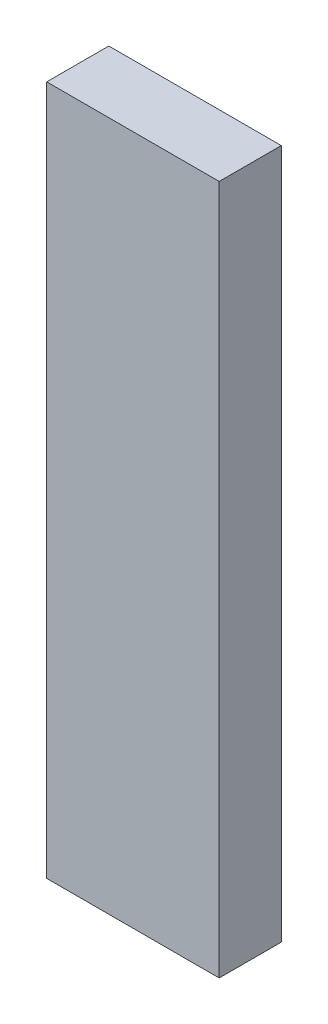
ISO-10303-21;
HEADER;
FILE_DESCRIPTION(('STEP AP214'),'2;1');
FILE_NAME('part.step','',(''),(''),'','','');
FILE_SCHEMA(('AUTOMOTIVE_DESIGN { 1 0 10303 214 1 1 1 1 }'));
ENDSEC;
DATA;
#1=APPLICATION_CONTEXT('core data for automotive mechanical design processes');
#2=APPLICATION_PROTOCOL_DEFINITION('international standard','automotive_design',2000,#1);
#3=PRODUCT_CONTEXT('',#1,'mechanical');
#4=PRODUCT('Part','Part','',(#3));
#5=PRODUCT_RELATED_PRODUCT_CATEGORY('part','',(#4));
#6=PRODUCT_DEFINITION_FORMATION('','',#4);
#7=PRODUCT_DEFINITION_CONTEXT('part definition',#1,'design');
#8=PRODUCT_DEFINITION('design','',#6,#7);
#9=PRODUCT_DEFINITION_SHAPE('','',#8);
#10=(LENGTH_UNIT() NAMED_UNIT(*) SI_UNIT(.MILLI.,.METRE.));
#11=(NAMED_UNIT(*) PLANE_ANGLE_UNIT() SI_UNIT($,.RADIAN.));
#12=(NAMED_UNIT(*) SI_UNIT($,.STERADIAN.) SOLID_ANGLE_UNIT());
#13=UNCERTAINTY_MEASURE_WITH_UNIT(LENGTH_MEASURE(1.E-05),#10,'distance_accuracy_value','');
#14=(GEOMETRIC_REPRESENTATION_CONTEXT(3) GLOBAL_UNCERTAINTY_ASSIGNED_CONTEXT((#13)) GLOBAL_UNIT_ASSIGNED_CONTEXT((#10,
#11,#12)) REPRESENTATION_CONTEXT('',''));
#15=CARTESIAN_POINT('',(0.,0.,0.));
#16=DIRECTION('',(0.,0.,1.));
#17=DIRECTION('',(1.,0.,0.));
#18=AXIS2_PLACEMENT_3D('',#15,#16,#17);
#19=CARTESIAN_POINT('',(0.,0.,18.));
#20=DIRECTION('',(1.,0.,0.));
#21=DIRECTION('',(0.,0.,-1.));
#22=AXIS2_PLACEMENT_3D('',#19,#20,#21);
#23=PLANE('',#22);
#24=DIRECTION('',(0.,-1.,0.));
#25=VECTOR('',#24,1.);
#26=CARTESIAN_POINT('',(0.,0.,0.));
#27=LINE('',#26,#25);
#28=CARTESIAN_POINT('',(0.,200.,0.));
#29=VERTEX_POINT('',#28);
#30=CARTESIAN_POINT('',(0.,0.,0.));
#31=VERTEX_POINT('',#30);
#32=EDGE_CURVE('E96',#29,#31,#27,.T.);
#33=ORIENTED_EDGE('',*,*,#32,.T.);
#34=DIRECTION('',(0.,0.,-1.));
#35=VECTOR('',#34,1.);
#36=CARTESIAN_POINT('',(0.,0.,18.));
#37=LINE('',#36,#35);
#38=CARTESIAN_POINT('',(0.,0.,18.));
#39=VERTEX_POINT('',#38);
#40=EDGE_CURVE('E11',#39,#31,#37,.T.);
#41=ORIENTED_EDGE('',*,*,#40,.F.);
#42=DIRECTION('',(0.,-1.,0.));
#43=VECTOR('',#42,1.);
#44=CARTESIAN_POINT('',(0.,0.,18.));
#45=LINE('',#44,#43);
#46=CARTESIAN_POINT('',(0.,200.,18.));
#47=VERTEX_POINT('',#46);
#48=EDGE_CURVE('E84',#47,#39,#45,.T.);
#49=ORIENTED_EDGE('',*,*,#48,.F.);
#50=DIRECTION('',(0.,0.,-1.));
#51=VECTOR('',#50,1.);
#52=CARTESIAN_POINT('',(0.,200.,18.));
#53=LINE('',#52,#51);
#54=EDGE_CURVE('E92',#47,#29,#53,.T.);
#55=ORIENTED_EDGE('',*,*,#54,.T.);
#56=EDGE_LOOP('',(#33,#41,#49,#55));
#57=FACE_BOUND('',#56,.T.);
#58=ADVANCED_FACE('F33',(#57),#23,.F.);
#59=CARTESIAN_POINT('',(0.,0.,18.));
#60=DIRECTION('',(0.,1.,0.));
#61=DIRECTION('',(0.,0.,1.));
#62=AXIS2_PLACEMENT_3D('',#59,#60,#61);
#63=PLANE('',#62);
#64=DIRECTION('',(1.,0.,0.));
#65=VECTOR('',#64,1.);
#66=CARTESIAN_POINT('',(0.,0.,0.));
#67=LINE('',#66,#65);
#68=CARTESIAN_POINT('',(50.,0.,0.));
#69=VERTEX_POINT('',#68);
#70=EDGE_CURVE('E88',#31,#69,#67,.T.);
#71=ORIENTED_EDGE('',*,*,#70,.T.);
#72=DIRECTION('',(0.,0.,-1.));
#73=VECTOR('',#72,1.);
#74=CARTESIAN_POINT('',(50.,0.,18.));
#75=LINE('',#74,#73);
#76=CARTESIAN_POINT('',(50.,0.,18.));
#77=VERTEX_POINT('',#76);
#78=EDGE_CURVE('E41',#77,#69,#75,.T.);
#79=ORIENTED_EDGE('',*,*,#78,.F.);
#80=DIRECTION('',(1.,0.,0.));
#81=VECTOR('',#80,1.);
#82=CARTESIAN_POINT('',(0.,0.,18.));
#83=LINE('',#82,#81);
#84=EDGE_CURVE('E79',#39,#77,#83,.T.);
#85=ORIENTED_EDGE('',*,*,#84,.F.);
#86=ORIENTED_EDGE('',*,*,#40,.T.);
#87=EDGE_LOOP('',(#71,#79,#85,#86));
#88=FACE_BOUND('',#87,.T.);
#89=ADVANCED_FACE('F87',(#88),#63,.F.);
#90=CARTESIAN_POINT('',(50.,0.,18.));
#91=DIRECTION('',(-1.,0.,0.));
#92=DIRECTION('',(0.,0.,1.));
#93=AXIS2_PLACEMENT_3D('',#90,#91,#92);
#94=PLANE('',#93);
#95=DIRECTION('',(0.,1.,0.));
#96=VECTOR('',#95,1.);
#97=CARTESIAN_POINT('',(50.,0.,0.));
#98=LINE('',#97,#96);
#99=CARTESIAN_POINT('',(50.,200.,0.));
#100=VERTEX_POINT('',#99);
#101=EDGE_CURVE('E66',#69,#100,#98,.T.);
#102=ORIENTED_EDGE('',*,*,#101,.T.);
#103=DIRECTION('',(0.,0.,-1.));
#104=VECTOR('',#103,1.);
#105=CARTESIAN_POINT('',(50.,200.,18.));
#106=LINE('',#105,#104);
#107=CARTESIAN_POINT('',(50.,200.,18.));
#108=VERTEX_POINT('',#107);
#109=EDGE_CURVE('E89',#108,#100,#106,.T.);
#110=ORIENTED_EDGE('',*,*,#109,.F.);
#111=DIRECTION('',(0.,1.,0.));
#112=VECTOR('',#111,1.);
#113=CARTESIAN_POINT('',(50.,0.,18.));
#114=LINE('',#113,#112);
#115=EDGE_CURVE('E82',#77,#108,#114,.T.);
#116=ORIENTED_EDGE('',*,*,#115,.F.);
#117=ORIENTED_EDGE('',*,*,#78,.T.);
#118=EDGE_LOOP('',(#102,#110,#116,#117));
#119=FACE_BOUND('',#118,.T.);
#120=ADVANCED_FACE('F90',(#119),#94,.F.);
#121=CARTESIAN_POINT('',(0.,200.,18.));
#122=DIRECTION('',(0.,-1.,0.));
#123=DIRECTION('',(0.,0.,-1.));
#124=AXIS2_PLACEMENT_3D('',#121,#122,#123);
#125=PLANE('',#124);
#126=DIRECTION('',(-1.,0.,0.));
#127=VECTOR('',#126,1.);
#128=CARTESIAN_POINT('',(0.,200.,0.));
#129=LINE('',#128,#127);
#130=EDGE_CURVE('E72',#100,#29,#129,.T.);
#131=ORIENTED_EDGE('',*,*,#130,.T.);
#132=ORIENTED_EDGE('',*,*,#54,.F.);
#133=DIRECTION('',(-1.,0.,0.));
#134=VECTOR('',#133,1.);
#135=CARTESIAN_POINT('',(0.,200.,18.));
#136=LINE('',#135,#134);
#137=EDGE_CURVE('E49',#108,#47,#136,.T.);
#138=ORIENTED_EDGE('',*,*,#137,.F.);
#139=ORIENTED_EDGE('',*,*,#109,.T.);
#140=EDGE_LOOP('',(#131,#132,#138,#139));
#141=FACE_BOUND('',#140,.T.);
#142=ADVANCED_FACE('F103',(#141),#125,.F.);
#143=CARTESIAN_POINT('',(0.,0.,18.));
#144=DIRECTION('',(0.,0.,-1.));
#145=DIRECTION('',(-1.,0.,0.));
#146=AXIS2_PLACEMENT_3D('',#143,#144,#145);
#147=PLANE('',#146);
#148=ORIENTED_EDGE('',*,*,#48,.T.);
#149=ORIENTED_EDGE('',*,*,#84,.T.);
#150=ORIENTED_EDGE('',*,*,#115,.T.);
#151=ORIENTED_EDGE('',*,*,#137,.T.);
#152=EDGE_LOOP('',(#148,#149,#150,#151));
#153=FACE_BOUND('',#152,.T.);
#154=ADVANCED_FACE('F80',(#153),#147,.F.);
#155=CARTESIAN_POINT('',(0.,0.,0.));
#156=DIRECTION('',(0.,0.,-1.));
#157=DIRECTION('',(-1.,0.,0.));
#158=AXIS2_PLACEMENT_3D('',#155,#156,#157);
#159=PLANE('',#158);
#160=ORIENTED_EDGE('',*,*,#32,.F.);
#161=ORIENTED_EDGE('',*,*,#130,.F.);
#162=ORIENTED_EDGE('',*,*,#101,.F.);
#163=ORIENTED_EDGE('',*,*,#70,.F.);
#164=EDGE_LOOP('',(#160,#161,#162,#163));
#165=FACE_BOUND('',#164,.T.);
#166=ADVANCED_FACE('F106',(#165),#159,.T.);
#167=CLOSED_SHELL('',(#58,#89,#120,#142,#154,#166));
#168=MANIFOLD_SOLID_BREP('B2',#167);
#169=ADVANCED_BREP_SHAPE_REPRESENTATION('',(#18,#168),#14);
#170=SHAPE_DEFINITION_REPRESENTATION(#9,#169);
ENDSEC;
END-ISO-10303-21;
